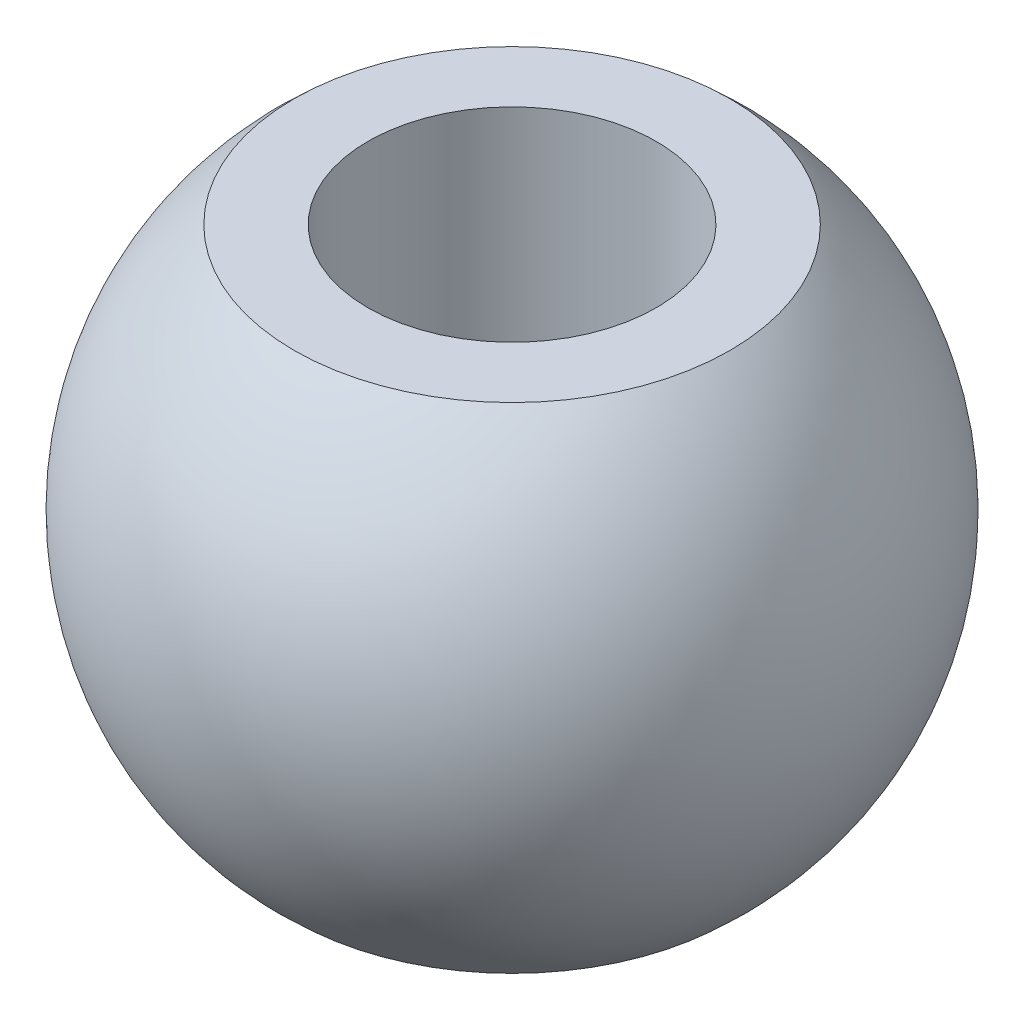
ISO-10303-21;
HEADER;
FILE_DESCRIPTION(('STEP AP214'),'2;1');
FILE_NAME('part.step','',(''),(''),'','','');
FILE_SCHEMA(('AUTOMOTIVE_DESIGN { 1 0 10303 214 1 1 1 1 }'));
ENDSEC;
DATA;
#1=APPLICATION_CONTEXT('core data for automotive mechanical design processes');
#2=APPLICATION_PROTOCOL_DEFINITION('international standard','automotive_design',2000,#1);
#3=PRODUCT_CONTEXT('',#1,'mechanical');
#4=PRODUCT('Part','Part','',(#3));
#5=PRODUCT_RELATED_PRODUCT_CATEGORY('part','',(#4));
#6=PRODUCT_DEFINITION_FORMATION('','',#4);
#7=PRODUCT_DEFINITION_CONTEXT('part definition',#1,'design');
#8=PRODUCT_DEFINITION('design','',#6,#7);
#9=PRODUCT_DEFINITION_SHAPE('','',#8);
#10=(LENGTH_UNIT() NAMED_UNIT(*) SI_UNIT(.MILLI.,.METRE.));
#11=(NAMED_UNIT(*) PLANE_ANGLE_UNIT() SI_UNIT($,.RADIAN.));
#12=(NAMED_UNIT(*) SI_UNIT($,.STERADIAN.) SOLID_ANGLE_UNIT());
#13=UNCERTAINTY_MEASURE_WITH_UNIT(LENGTH_MEASURE(1.E-05),#10,'distance_accuracy_value','');
#14=(GEOMETRIC_REPRESENTATION_CONTEXT(3) GLOBAL_UNCERTAINTY_ASSIGNED_CONTEXT((#13)) GLOBAL_UNIT_ASSIGNED_CONTEXT((#10,
#11,#12)) REPRESENTATION_CONTEXT('',''));
#15=CARTESIAN_POINT('',(0.,0.,0.));
#16=DIRECTION('',(0.,0.,1.));
#17=DIRECTION('',(1.,0.,0.));
#18=AXIS2_PLACEMENT_3D('',#15,#16,#17);
#19=CARTESIAN_POINT('',(-1.75,3.,0.));
#20=DIRECTION('',(0.,1.,0.));
#21=DIRECTION('',(0.,0.,1.));
#22=AXIS2_PLACEMENT_3D('',#19,#20,#21);
#23=PLANE('',#22);
#24=CARTESIAN_POINT('',(0.,3.,0.));
#25=DIRECTION('',(0.,1.,0.));
#26=DIRECTION('',(0.,0.,1.));
#27=AXIS2_PLACEMENT_3D('',#24,#25,#26);
#28=CIRCLE('',#27,2.64575131106459);
#29=CARTESIAN_POINT('',(-2.64575131106459,3.,0.));
#30=VERTEX_POINT('',#29);
#31=EDGE_CURVE('E10',#30,#30,#28,.T.);
#32=ORIENTED_EDGE('',*,*,#31,.T.);
#33=EDGE_LOOP('',(#32));
#34=FACE_BOUND('',#33,.T.);
#35=CARTESIAN_POINT('',(0.,3.,0.));
#36=DIRECTION('',(0.,1.,0.));
#37=DIRECTION('',(0.,0.,1.));
#38=AXIS2_PLACEMENT_3D('',#35,#36,#37);
#39=CIRCLE('',#38,1.75);
#40=CARTESIAN_POINT('',(0.,3.,1.75));
#41=VERTEX_POINT('',#40);
#42=EDGE_CURVE('E46',#41,#41,#39,.T.);
#43=ORIENTED_EDGE('',*,*,#42,.F.);
#44=EDGE_LOOP('',(#43));
#45=FACE_BOUND('',#44,.T.);
#46=ADVANCED_FACE('F32',(#34,#45),#23,.T.);
#47=CARTESIAN_POINT('',(0.,0.,0.));
#48=DIRECTION('',(0.,1.,0.));
#49=DIRECTION('',(-1.,0.,0.));
#50=AXIS2_PLACEMENT_3D('',#47,#48,#49);
#51=SPHERICAL_SURFACE('',#50,4.);
#52=CARTESIAN_POINT('',(0.,-3.,0.));
#53=DIRECTION('',(0.,1.,0.));
#54=DIRECTION('',(0.,0.,1.));
#55=AXIS2_PLACEMENT_3D('',#52,#53,#54);
#56=CIRCLE('',#55,2.64575131106459);
#57=CARTESIAN_POINT('',(-2.64575131106459,-3.,0.));
#58=VERTEX_POINT('',#57);
#59=EDGE_CURVE('E38',#58,#58,#56,.T.);
#60=CARTESIAN_POINT('',(-2.64575131106459,-3.,0.));
#61=CARTESIAN_POINT('',(-2.69875651187134,-2.95325632278245,0.));
#62=CARTESIAN_POINT('',(-2.75052029684331,-2.90510527447022,0.));
#63=CARTESIAN_POINT('',(-2.85142545255604,-2.80612960257577,0.));
#64=CARTESIAN_POINT('',(-2.9005668232968,-2.75530497899356,0.));
#65=CARTESIAN_POINT('',(-2.99608756798547,-2.65112332347855,0.));
#66=CARTESIAN_POINT('',(-3.04246694193337,-2.59776629154575,0.));
#67=CARTESIAN_POINT('',(-3.13233384188064,-2.48867011130153,0.));
#68=CARTESIAN_POINT('',(-3.17582136788002,-2.4329309629901,0.));
#69=CARTESIAN_POINT('',(-3.2597823144284,-2.31922699358693,0.));
#70=CARTESIAN_POINT('',(-3.3002557349774,-2.26126217249517,0.));
#71=CARTESIAN_POINT('',(-3.37807482070356,-2.14326969696134,0.));
#72=CARTESIAN_POINT('',(-3.41542048588072,-2.08324204251927,0.));
#73=CARTESIAN_POINT('',(-3.48687915806733,-1.9612924949961,0.));
#74=CARTESIAN_POINT('',(-3.52099216507678,-1.89937060191501,0.));
#75=CARTESIAN_POINT('',(-3.58588970804608,-1.77380650264688,0.));
#76=CARTESIAN_POINT('',(-3.61667424400594,-1.71016429645984,0.));
#77=CARTESIAN_POINT('',(-3.67482837812324,-1.58133832566934,0.));
#78=CARTESIAN_POINT('',(-3.70219797628069,-1.51615456106588,0.));
#79=CARTESIAN_POINT('',(-3.75344536048972,-1.38442855873451,0.));
#80=CARTESIAN_POINT('',(-3.7773231465413,-1.3178863210066,0.));
#81=CARTESIAN_POINT('',(-3.82151983967928,-1.18363027313511,0.));
#82=CARTESIAN_POINT('',(-3.84183874676568,-1.11591646299152,0.));
#83=CARTESIAN_POINT('',(-3.87886061118061,-0.979507461709121,0.));
#84=CARTESIAN_POINT('',(-3.89556356850913,-0.910812270570318,0.));
#85=CARTESIAN_POINT('',(-3.92530661891354,-0.772633455161072,0.));
#86=CARTESIAN_POINT('',(-3.93834671198941,-0.703149830890628,0.));
#87=CARTESIAN_POINT('',(-3.96072740748069,-0.563589311599923,0.));
#88=CARTESIAN_POINT('',(-3.9700680098961,-0.49351241657966,0.));
#89=CARTESIAN_POINT('',(-3.98502348861544,-0.352962184521472,0.));
#90=CARTESIAN_POINT('',(-3.99063836491936,-0.282488847483546,0.));
#91=CARTESIAN_POINT('',(-3.99812662061164,-0.141343673630414,0.));
#92=CARTESIAN_POINT('',(-4.,-0.0706718368152074,0.));
#93=CARTESIAN_POINT('',(-4.,0.0706718368152056,0.));
#94=CARTESIAN_POINT('',(-3.99812662061164,0.141343673630412,0.));
#95=CARTESIAN_POINT('',(-3.99063836491936,0.282488847483544,0.));
#96=CARTESIAN_POINT('',(-3.98502348861544,0.35296218452147,0.));
#97=CARTESIAN_POINT('',(-3.97006800989611,0.493512416579658,0.));
#98=CARTESIAN_POINT('',(-3.96072740748069,0.563589311599921,0.));
#99=CARTESIAN_POINT('',(-3.93834671198941,0.703149830890627,0.));
#100=CARTESIAN_POINT('',(-3.92530661891354,0.77263345516107,0.));
#101=CARTESIAN_POINT('',(-3.89556356850914,0.910812270570316,0.));
#102=CARTESIAN_POINT('',(-3.87886061118061,0.979507461709119,0.));
#103=CARTESIAN_POINT('',(-3.84183874676568,1.11591646299151,0.));
#104=CARTESIAN_POINT('',(-3.82151983967928,1.18363027313511,0.));
#105=CARTESIAN_POINT('',(-3.7773231465413,1.3178863210066,0.));
#106=CARTESIAN_POINT('',(-3.75344536048972,1.38442855873451,0.));
#107=CARTESIAN_POINT('',(-3.70219797628069,1.51615456106587,0.));
#108=CARTESIAN_POINT('',(-3.67482837812324,1.58133832566934,0.));
#109=CARTESIAN_POINT('',(-3.61667424400594,1.71016429645984,0.));
#110=CARTESIAN_POINT('',(-3.58588970804608,1.77380650264688,0.));
#111=CARTESIAN_POINT('',(-3.52099216507678,1.89937060191501,0.));
#112=CARTESIAN_POINT('',(-3.48687915806733,1.9612924949961,0.));
#113=CARTESIAN_POINT('',(-3.41542048588072,2.08324204251927,0.));
#114=CARTESIAN_POINT('',(-3.37807482070356,2.14326969696134,0.));
#115=CARTESIAN_POINT('',(-3.3002557349774,2.26126217249517,0.));
#116=CARTESIAN_POINT('',(-3.2597823144284,2.31922699358693,0.));
#117=CARTESIAN_POINT('',(-3.17582136788002,2.4329309629901,0.));
#118=CARTESIAN_POINT('',(-3.13233384188064,2.48867011130152,0.));
#119=CARTESIAN_POINT('',(-3.04246694193337,2.59776629154575,0.));
#120=CARTESIAN_POINT('',(-2.99608756798547,2.65112332347855,0.));
#121=CARTESIAN_POINT('',(-2.90056682329681,2.75530497899356,0.));
#122=CARTESIAN_POINT('',(-2.85142545255604,2.80612960257577,0.));
#123=CARTESIAN_POINT('',(-2.75052029684331,2.90510527447022,0.));
#124=CARTESIAN_POINT('',(-2.69875651187134,2.95325632278245,0.));
#125=CARTESIAN_POINT('',(-2.64575131106459,3.,0.));
#126=B_SPLINE_CURVE_WITH_KNOTS('',3,(#60,#61,#62,#63,#64,#65,#66,#67,#68,#69,#70,#71,#72,#73,
#74,#75,#76,#77,#78,#79,#80,#81,#82,#83,#84,#85,#86,#87,#88,#89,#90,#91,#92,#93,#94,#95,#96,#97,
#98,#99,#100,#101,#102,#103,#104,#105,#106,#107,#108,#109,#110,#111,#112,#113,#114,#115,#116,
#117,#118,#119,#120,#121,#122,#123,#124,#125),.UNSPECIFIED.,.F.,.F.,(4,2,2,2,2,2,2,2,2,2,2,2,2,
2,2,2,2,2,2,2,2,2,2,2,2,2,2,2,2,2,2,2,4),(0.,0.211990702333813,0.423981404667625,
0.635972107001438,0.84796280933525,1.05995351166906,1.27194421400287,1.48393491633669,
1.6959256186705,1.90791632100431,2.11990702333812,2.33189772567194,2.54388842800575,
2.75587913033956,2.96786983267337,3.17986053500719,3.391851237341,3.60384193967481,
3.81583264200862,4.02782334434244,4.23981404667625,4.45180474901006,4.66379545134387,
4.87578615367769,5.0877768560115,5.29976755834531,5.51175826067912,5.72374896301293,
5.93573966534675,6.14773036768056,6.35972107001437,6.57171177234818,6.783702474682),.UNSPECIFIED.);
#127=EDGE_CURVE('BSEAM56',#58,#30,#126,.T.);
#128=ORIENTED_EDGE('',*,*,#59,.T.);
#129=ORIENTED_EDGE('',*,*,#31,.F.);
#130=ORIENTED_EDGE('',*,*,#127,.T.);
#131=ORIENTED_EDGE('',*,*,#127,.F.);
#132=EDGE_LOOP('',(#128,#130,#129,#131));
#133=FACE_BOUND('',#132,.T.);
#134=ADVANCED_FACE('F56',(#133),#51,.T.);
#135=CARTESIAN_POINT('',(-1.75,-3.,0.));
#136=DIRECTION('',(0.,-1.,0.));
#137=DIRECTION('',(0.,0.,-1.));
#138=AXIS2_PLACEMENT_3D('',#135,#136,#137);
#139=PLANE('',#138);
#140=CARTESIAN_POINT('',(0.,-3.,0.));
#141=DIRECTION('',(0.,1.,0.));
#142=DIRECTION('',(0.,0.,1.));
#143=AXIS2_PLACEMENT_3D('',#140,#141,#142);
#144=CIRCLE('',#143,1.75);
#145=CARTESIAN_POINT('',(0.,-3.,1.75));
#146=VERTEX_POINT('',#145);
#147=EDGE_CURVE('E42',#146,#146,#144,.T.);
#148=ORIENTED_EDGE('',*,*,#147,.T.);
#149=EDGE_LOOP('',(#148));
#150=FACE_BOUND('',#149,.T.);
#151=ORIENTED_EDGE('',*,*,#59,.F.);
#152=EDGE_LOOP('',(#151));
#153=FACE_BOUND('',#152,.T.);
#154=ADVANCED_FACE('F60',(#150,#153),#139,.T.);
#155=CARTESIAN_POINT('',(0.,3.89426841095272,0.));
#156=DIRECTION('',(0.,1.,0.));
#157=DIRECTION('',(0.,0.,1.));
#158=AXIS2_PLACEMENT_3D('',#155,#156,#157);
#159=CYLINDRICAL_SURFACE('',#158,1.75);
#160=ORIENTED_EDGE('',*,*,#42,.T.);
#161=EDGE_LOOP('',(#160));
#162=FACE_BOUND('',#161,.T.);
#163=ORIENTED_EDGE('',*,*,#147,.F.);
#164=EDGE_LOOP('',(#163));
#165=FACE_BOUND('',#164,.T.);
#166=ADVANCED_FACE('F52',(#162,#165),#159,.F.);
#167=CLOSED_SHELL('',(#46,#134,#154,#166));
#168=MANIFOLD_SOLID_BREP('B2',#167);
#169=ADVANCED_BREP_SHAPE_REPRESENTATION('',(#18,#168),#14);
#170=SHAPE_DEFINITION_REPRESENTATION(#9,#169);
ENDSEC;
END-ISO-10303-21;
